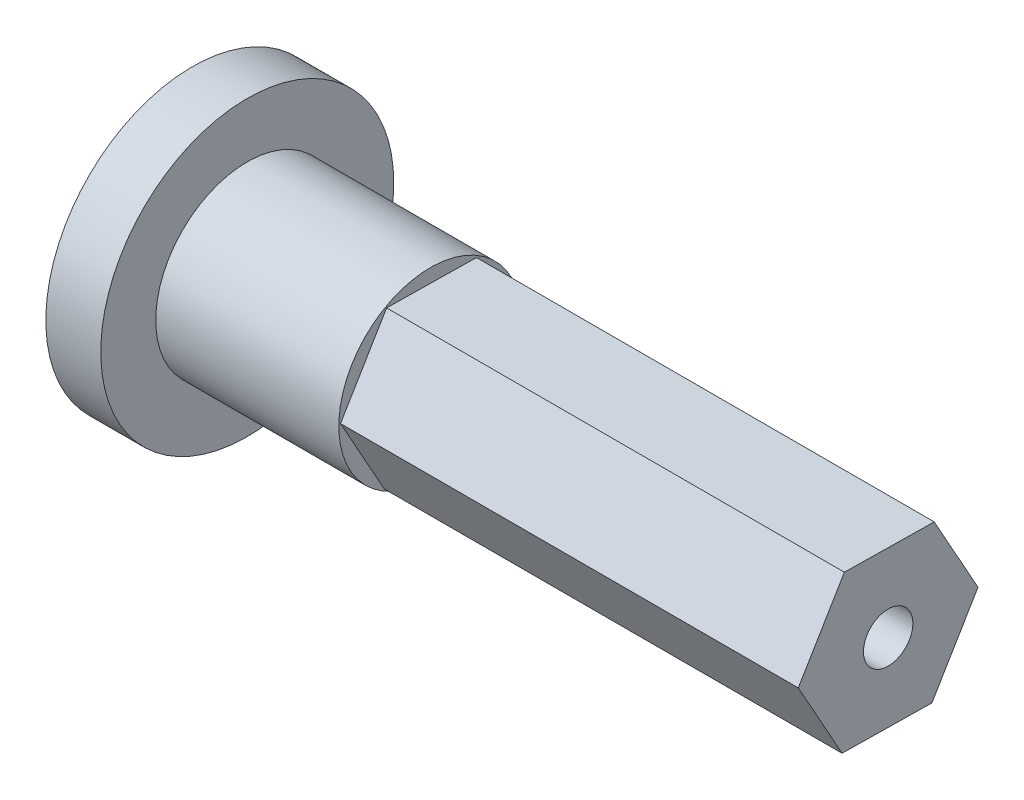
ISO-10303-21;
HEADER;
FILE_DESCRIPTION(('STEP AP214'),'2;1');
FILE_NAME('part.step','',(''),(''),'','','');
FILE_SCHEMA(('AUTOMOTIVE_DESIGN { 1 0 10303 214 1 1 1 1 }'));
ENDSEC;
DATA;
#1=APPLICATION_CONTEXT('core data for automotive mechanical design processes');
#2=APPLICATION_PROTOCOL_DEFINITION('international standard','automotive_design',2000,#1);
#3=PRODUCT_CONTEXT('',#1,'mechanical');
#4=PRODUCT('Part','Part','',(#3));
#5=PRODUCT_RELATED_PRODUCT_CATEGORY('part','',(#4));
#6=PRODUCT_DEFINITION_FORMATION('','',#4);
#7=PRODUCT_DEFINITION_CONTEXT('part definition',#1,'design');
#8=PRODUCT_DEFINITION('design','',#6,#7);
#9=PRODUCT_DEFINITION_SHAPE('','',#8);
#10=(LENGTH_UNIT() NAMED_UNIT(*) SI_UNIT(.MILLI.,.METRE.));
#11=(NAMED_UNIT(*) PLANE_ANGLE_UNIT() SI_UNIT($,.RADIAN.));
#12=(NAMED_UNIT(*) SI_UNIT($,.STERADIAN.) SOLID_ANGLE_UNIT());
#13=UNCERTAINTY_MEASURE_WITH_UNIT(LENGTH_MEASURE(1.E-05),#10,'distance_accuracy_value','');
#14=(GEOMETRIC_REPRESENTATION_CONTEXT(3) GLOBAL_UNCERTAINTY_ASSIGNED_CONTEXT((#13)) GLOBAL_UNIT_ASSIGNED_CONTEXT((#10,
#11,#12)) REPRESENTATION_CONTEXT('',''));
#15=CARTESIAN_POINT('',(0.,0.,0.));
#16=DIRECTION('',(0.,0.,1.));
#17=DIRECTION('',(1.,0.,0.));
#18=AXIS2_PLACEMENT_3D('',#15,#16,#17);
#19=CARTESIAN_POINT('',(3.,0.,0.));
#20=DIRECTION('',(-1.,0.,0.));
#21=DIRECTION('',(0.,0.,1.));
#22=AXIS2_PLACEMENT_3D('',#19,#20,#21);
#23=CYLINDRICAL_SURFACE('',#22,8.);
#24=CARTESIAN_POINT('',(3.,0.,0.));
#25=DIRECTION('',(1.,0.,0.));
#26=DIRECTION('',(0.,0.,-1.));
#27=AXIS2_PLACEMENT_3D('',#24,#25,#26);
#28=CIRCLE('',#27,8.);
#29=CARTESIAN_POINT('',(3.,0.,-8.));
#30=VERTEX_POINT('',#29);
#31=EDGE_CURVE('E47',#30,#30,#28,.T.);
#32=ORIENTED_EDGE('',*,*,#31,.F.);
#33=EDGE_LOOP('',(#32));
#34=FACE_BOUND('',#33,.T.);
#35=CARTESIAN_POINT('',(0.,0.,0.));
#36=DIRECTION('',(1.,0.,0.));
#37=DIRECTION('',(0.,0.,-1.));
#38=AXIS2_PLACEMENT_3D('',#35,#36,#37);
#39=CIRCLE('',#38,8.);
#40=CARTESIAN_POINT('',(0.,0.,-8.));
#41=VERTEX_POINT('',#40);
#42=EDGE_CURVE('E42',#41,#41,#39,.T.);
#43=ORIENTED_EDGE('',*,*,#42,.T.);
#44=EDGE_LOOP('',(#43));
#45=FACE_BOUND('',#44,.T.);
#46=ADVANCED_FACE('F39',(#34,#45),#23,.T.);
#47=CARTESIAN_POINT('',(3.,0.,0.));
#48=DIRECTION('',(1.,0.,0.));
#49=DIRECTION('',(0.,0.,-1.));
#50=AXIS2_PLACEMENT_3D('',#47,#48,#49);
#51=PLANE('',#50);
#52=CARTESIAN_POINT('',(3.,0.,0.));
#53=DIRECTION('',(1.,0.,0.));
#54=DIRECTION('',(0.,0.,-1.));
#55=AXIS2_PLACEMENT_3D('',#52,#53,#54);
#56=CIRCLE('',#55,5.);
#57=CARTESIAN_POINT('',(3.,0.,-5.));
#58=VERTEX_POINT('',#57);
#59=EDGE_CURVE('E11',#58,#58,#56,.T.);
#60=ORIENTED_EDGE('',*,*,#59,.F.);
#61=EDGE_LOOP('',(#60));
#62=FACE_BOUND('',#61,.T.);
#63=ORIENTED_EDGE('',*,*,#31,.T.);
#64=EDGE_LOOP('',(#63));
#65=FACE_BOUND('',#64,.T.);
#66=ADVANCED_FACE('F247',(#62,#65),#51,.T.);
#67=CARTESIAN_POINT('',(0.,0.,0.));
#68=DIRECTION('',(1.,0.,0.));
#69=DIRECTION('',(0.,0.,-1.));
#70=AXIS2_PLACEMENT_3D('',#67,#68,#69);
#71=PLANE('',#70);
#72=DIRECTION('',(0.,0.5,0.866025403784439));
#73=VECTOR('',#72,1.);
#74=CARTESIAN_POINT('',(0.,-2.3094010767585,0.));
#75=LINE('',#74,#73);
#76=CARTESIAN_POINT('',(0.,-2.3094010767585,0.));
#77=VERTEX_POINT('',#76);
#78=CARTESIAN_POINT('',(0.,-1.15470053837925,2.));
#79=VERTEX_POINT('',#78);
#80=EDGE_CURVE('E164',#77,#79,#75,.T.);
#81=ORIENTED_EDGE('',*,*,#80,.F.);
#82=DIRECTION('',(0.,-0.5,0.866025403784439));
#83=VECTOR('',#82,1.);
#84=CARTESIAN_POINT('',(0.,-1.15470053837925,-2.));
#85=LINE('',#84,#83);
#86=CARTESIAN_POINT('',(0.,-1.15470053837925,-2.));
#87=VERTEX_POINT('',#86);
#88=EDGE_CURVE('E55',#87,#77,#85,.T.);
#89=ORIENTED_EDGE('',*,*,#88,.F.);
#90=DIRECTION('',(0.,-1.,0.));
#91=VECTOR('',#90,1.);
#92=CARTESIAN_POINT('',(0.,1.15470053837925,-2.));
#93=LINE('',#92,#91);
#94=CARTESIAN_POINT('',(0.,1.15470053837925,-2.));
#95=VERTEX_POINT('',#94);
#96=EDGE_CURVE('E150',#95,#87,#93,.T.);
#97=ORIENTED_EDGE('',*,*,#96,.F.);
#98=DIRECTION('',(0.,-0.5,-0.866025403784439));
#99=VECTOR('',#98,1.);
#100=CARTESIAN_POINT('',(0.,2.3094010767585,0.));
#101=LINE('',#100,#99);
#102=CARTESIAN_POINT('',(0.,2.3094010767585,0.));
#103=VERTEX_POINT('',#102);
#104=EDGE_CURVE('E153',#103,#95,#101,.T.);
#105=ORIENTED_EDGE('',*,*,#104,.F.);
#106=DIRECTION('',(0.,0.5,-0.866025403784439));
#107=VECTOR('',#106,1.);
#108=CARTESIAN_POINT('',(0.,1.15470053837925,2.));
#109=LINE('',#108,#107);
#110=CARTESIAN_POINT('',(0.,1.15470053837925,2.));
#111=VERTEX_POINT('',#110);
#112=EDGE_CURVE('E169',#111,#103,#109,.T.);
#113=ORIENTED_EDGE('',*,*,#112,.F.);
#114=DIRECTION('',(0.,1.,0.));
#115=VECTOR('',#114,1.);
#116=CARTESIAN_POINT('',(0.,-1.15470053837925,2.));
#117=LINE('',#116,#115);
#118=EDGE_CURVE('E166',#79,#111,#117,.T.);
#119=ORIENTED_EDGE('',*,*,#118,.F.);
#120=EDGE_LOOP('',(#81,#89,#97,#105,#113,#119));
#121=FACE_BOUND('',#120,.T.);
#122=ORIENTED_EDGE('',*,*,#42,.F.);
#123=EDGE_LOOP('',(#122));
#124=FACE_BOUND('',#123,.T.);
#125=ADVANCED_FACE('F244',(#121,#124),#71,.F.);
#126=CARTESIAN_POINT('',(13.,0.,0.));
#127=DIRECTION('',(-1.,0.,0.));
#128=DIRECTION('',(0.,0.,1.));
#129=AXIS2_PLACEMENT_3D('',#126,#127,#128);
#130=CYLINDRICAL_SURFACE('',#129,5.);
#131=CARTESIAN_POINT('',(13.,0.,0.));
#132=DIRECTION('',(1.,0.,0.));
#133=DIRECTION('',(0.,0.,-1.));
#134=AXIS2_PLACEMENT_3D('',#131,#132,#133);
#135=CIRCLE('',#134,5.);
#136=CARTESIAN_POINT('',(13.,0.,-5.));
#137=VERTEX_POINT('',#136);
#138=EDGE_CURVE('E235',#137,#137,#135,.T.);
#139=ORIENTED_EDGE('',*,*,#138,.F.);
#140=EDGE_LOOP('',(#139));
#141=FACE_BOUND('',#140,.T.);
#142=ORIENTED_EDGE('',*,*,#59,.T.);
#143=EDGE_LOOP('',(#142));
#144=FACE_BOUND('',#143,.T.);
#145=ADVANCED_FACE('F246',(#141,#144),#130,.T.);
#146=CARTESIAN_POINT('',(13.,0.,0.));
#147=DIRECTION('',(1.,0.,0.));
#148=DIRECTION('',(0.,0.,-1.));
#149=AXIS2_PLACEMENT_3D('',#146,#147,#148);
#150=PLANE('',#149);
#151=DIRECTION('',(0.,-0.0149359954370282,-0.999888451798652));
#152=VECTOR('',#151,1.);
#153=CARTESIAN_POINT('',(13.,-4.21287689095299,2.51694291453096));
#154=LINE('',#153,#152);
#155=CARTESIAN_POINT('',(13.,-4.21287689095299,2.51694291453096));
#156=VERTEX_POINT('',#155);
#157=CARTESIAN_POINT('',(13.,-4.28617494933555,-2.38998695331622));
#158=VERTEX_POINT('',#157);
#159=EDGE_CURVE('E63',#156,#158,#154,.T.);
#160=ORIENTED_EDGE('',*,*,#159,.F.);
#161=DIRECTION('',(0.,-0.873396797926839,-0.487009274420051));
#162=VECTOR('',#161,1.);
#163=CARTESIAN_POINT('',(13.,0.0732980583825546,4.90692986784718));
#164=LINE('',#163,#162);
#165=CARTESIAN_POINT('',(13.,0.0732980583825546,4.90692986784718));
#166=VERTEX_POINT('',#165);
#167=EDGE_CURVE('E193',#166,#156,#164,.T.);
#168=ORIENTED_EDGE('',*,*,#167,.F.);
#169=DIRECTION('',(0.,-0.858460802489811,0.512879177378601));
#170=VECTOR('',#169,1.);
#171=CARTESIAN_POINT('',(13.,4.28617494933555,2.38998695331622));
#172=LINE('',#171,#170);
#173=CARTESIAN_POINT('',(13.,4.28617494933555,2.38998695331622));
#174=VERTEX_POINT('',#173);
#175=EDGE_CURVE('E214',#174,#166,#172,.T.);
#176=ORIENTED_EDGE('',*,*,#175,.F.);
#177=DIRECTION('',(0.,0.014935995437028,0.999888451798652));
#178=VECTOR('',#177,1.);
#179=CARTESIAN_POINT('',(13.,4.21287689095299,-2.51694291453096));
#180=LINE('',#179,#178);
#181=CARTESIAN_POINT('',(13.,4.21287689095299,-2.51694291453096));
#182=VERTEX_POINT('',#181);
#183=EDGE_CURVE('E211',#182,#174,#180,.T.);
#184=ORIENTED_EDGE('',*,*,#183,.F.);
#185=DIRECTION('',(0.,0.873396797926839,0.487009274420051));
#186=VECTOR('',#185,1.);
#187=CARTESIAN_POINT('',(13.,-0.0732980583825546,-4.90692986784717));
#188=LINE('',#187,#186);
#189=CARTESIAN_POINT('',(13.,-0.0732980583825546,-4.90692986784717));
#190=VERTEX_POINT('',#189);
#191=EDGE_CURVE('E208',#190,#182,#188,.T.);
#192=ORIENTED_EDGE('',*,*,#191,.F.);
#193=DIRECTION('',(0.,0.858460802489811,-0.5128791773786));
#194=VECTOR('',#193,1.);
#195=CARTESIAN_POINT('',(13.,-4.28617494933555,-2.38998695331622));
#196=LINE('',#195,#194);
#197=EDGE_CURVE('E205',#158,#190,#196,.T.);
#198=ORIENTED_EDGE('',*,*,#197,.F.);
#199=EDGE_LOOP('',(#160,#168,#176,#184,#192,#198));
#200=FACE_BOUND('',#199,.T.);
#201=ORIENTED_EDGE('',*,*,#138,.T.);
#202=EDGE_LOOP('',(#201));
#203=FACE_BOUND('',#202,.T.);
#204=ADVANCED_FACE('F254',(#200,#203),#150,.T.);
#205=CARTESIAN_POINT('',(38.,-4.21287689095299,2.51694291453096));
#206=DIRECTION('',(0.,0.999888451798652,-0.0149359954370282));
#207=DIRECTION('',(0.,0.0149359954370282,0.999888451798652));
#208=AXIS2_PLACEMENT_3D('',#205,#206,#207);
#209=PLANE('',#208);
#210=ORIENTED_EDGE('',*,*,#159,.T.);
#211=DIRECTION('',(-1.,0.,0.));
#212=VECTOR('',#211,1.);
#213=CARTESIAN_POINT('',(38.,-4.28617494933555,-2.38998695331622));
#214=LINE('',#213,#212);
#215=CARTESIAN_POINT('',(38.,-4.28617494933555,-2.38998695331622));
#216=VERTEX_POINT('',#215);
#217=EDGE_CURVE('E232',#216,#158,#214,.T.);
#218=ORIENTED_EDGE('',*,*,#217,.F.);
#219=DIRECTION('',(0.,-0.0149359954370282,-0.999888451798652));
#220=VECTOR('',#219,1.);
#221=CARTESIAN_POINT('',(38.,-4.21287689095299,2.51694291453096));
#222=LINE('',#221,#220);
#223=CARTESIAN_POINT('',(38.,-4.21287689095299,2.51694291453096));
#224=VERTEX_POINT('',#223);
#225=EDGE_CURVE('E189',#224,#216,#222,.T.);
#226=ORIENTED_EDGE('',*,*,#225,.F.);
#227=DIRECTION('',(-1.,0.,0.));
#228=VECTOR('',#227,1.);
#229=CARTESIAN_POINT('',(38.,-4.21287689095299,2.51694291453096));
#230=LINE('',#229,#228);
#231=EDGE_CURVE('E203',#224,#156,#230,.T.);
#232=ORIENTED_EDGE('',*,*,#231,.T.);
#233=EDGE_LOOP('',(#210,#218,#226,#232));
#234=FACE_BOUND('',#233,.T.);
#235=ADVANCED_FACE('F281',(#234),#209,.F.);
#236=CARTESIAN_POINT('',(38.,-4.28617494933555,-2.38998695331622));
#237=DIRECTION('',(0.,0.5128791773786,0.858460802489811));
#238=DIRECTION('',(0.,-0.858460802489811,0.5128791773786));
#239=AXIS2_PLACEMENT_3D('',#236,#237,#238);
#240=PLANE('',#239);
#241=ORIENTED_EDGE('',*,*,#197,.T.);
#242=DIRECTION('',(-1.,0.,0.));
#243=VECTOR('',#242,1.);
#244=CARTESIAN_POINT('',(38.,-0.0732980583825546,-4.90692986784717));
#245=LINE('',#244,#243);
#246=CARTESIAN_POINT('',(38.,-0.0732980583825546,-4.90692986784717));
#247=VERTEX_POINT('',#246);
#248=EDGE_CURVE('E229',#247,#190,#245,.T.);
#249=ORIENTED_EDGE('',*,*,#248,.F.);
#250=DIRECTION('',(0.,0.858460802489811,-0.5128791773786));
#251=VECTOR('',#250,1.);
#252=CARTESIAN_POINT('',(38.,-4.28617494933555,-2.38998695331622));
#253=LINE('',#252,#251);
#254=EDGE_CURVE('E192',#216,#247,#253,.T.);
#255=ORIENTED_EDGE('',*,*,#254,.F.);
#256=ORIENTED_EDGE('',*,*,#217,.T.);
#257=EDGE_LOOP('',(#241,#249,#255,#256));
#258=FACE_BOUND('',#257,.T.);
#259=ADVANCED_FACE('F289',(#258),#240,.F.);
#260=CARTESIAN_POINT('',(38.,-0.0732980583825546,-4.90692986784717));
#261=DIRECTION('',(0.,-0.487009274420051,0.873396797926839));
#262=DIRECTION('',(0.,-0.873396797926839,-0.487009274420051));
#263=AXIS2_PLACEMENT_3D('',#260,#261,#262);
#264=PLANE('',#263);
#265=ORIENTED_EDGE('',*,*,#191,.T.);
#266=DIRECTION('',(-1.,0.,0.));
#267=VECTOR('',#266,1.);
#268=CARTESIAN_POINT('',(38.,4.21287689095299,-2.51694291453096));
#269=LINE('',#268,#267);
#270=CARTESIAN_POINT('',(38.,4.21287689095299,-2.51694291453096));
#271=VERTEX_POINT('',#270);
#272=EDGE_CURVE('E226',#271,#182,#269,.T.);
#273=ORIENTED_EDGE('',*,*,#272,.F.);
#274=DIRECTION('',(0.,0.873396797926839,0.487009274420051));
#275=VECTOR('',#274,1.);
#276=CARTESIAN_POINT('',(38.,-0.0732980583825546,-4.90692986784717));
#277=LINE('',#276,#275);
#278=EDGE_CURVE('E195',#247,#271,#277,.T.);
#279=ORIENTED_EDGE('',*,*,#278,.F.);
#280=ORIENTED_EDGE('',*,*,#248,.T.);
#281=EDGE_LOOP('',(#265,#273,#279,#280));
#282=FACE_BOUND('',#281,.T.);
#283=ADVANCED_FACE('F298',(#282),#264,.F.);
#284=CARTESIAN_POINT('',(38.,4.21287689095299,-2.51694291453096));
#285=DIRECTION('',(0.,-0.999888451798652,0.014935995437028));
#286=DIRECTION('',(0.,-0.014935995437028,-0.999888451798652));
#287=AXIS2_PLACEMENT_3D('',#284,#285,#286);
#288=PLANE('',#287);
#289=ORIENTED_EDGE('',*,*,#183,.T.);
#290=DIRECTION('',(-1.,0.,0.));
#291=VECTOR('',#290,1.);
#292=CARTESIAN_POINT('',(38.,4.28617494933555,2.38998695331622));
#293=LINE('',#292,#291);
#294=CARTESIAN_POINT('',(38.,4.28617494933555,2.38998695331622));
#295=VERTEX_POINT('',#294);
#296=EDGE_CURVE('E223',#295,#174,#293,.T.);
#297=ORIENTED_EDGE('',*,*,#296,.F.);
#298=DIRECTION('',(0.,0.014935995437028,0.999888451798652));
#299=VECTOR('',#298,1.);
#300=CARTESIAN_POINT('',(38.,4.21287689095299,-2.51694291453096));
#301=LINE('',#300,#299);
#302=EDGE_CURVE('E197',#271,#295,#301,.T.);
#303=ORIENTED_EDGE('',*,*,#302,.F.);
#304=ORIENTED_EDGE('',*,*,#272,.T.);
#305=EDGE_LOOP('',(#289,#297,#303,#304));
#306=FACE_BOUND('',#305,.T.);
#307=ADVANCED_FACE('F307',(#306),#288,.F.);
#308=CARTESIAN_POINT('',(38.,4.28617494933555,2.38998695331622));
#309=DIRECTION('',(0.,-0.512879177378601,-0.858460802489811));
#310=DIRECTION('',(0.,0.858460802489811,-0.512879177378601));
#311=AXIS2_PLACEMENT_3D('',#308,#309,#310);
#312=PLANE('',#311);
#313=ORIENTED_EDGE('',*,*,#175,.T.);
#314=DIRECTION('',(-1.,0.,0.));
#315=VECTOR('',#314,1.);
#316=CARTESIAN_POINT('',(38.,0.0732980583825546,4.90692986784718));
#317=LINE('',#316,#315);
#318=CARTESIAN_POINT('',(38.,0.0732980583825546,4.90692986784718));
#319=VERTEX_POINT('',#318);
#320=EDGE_CURVE('E220',#319,#166,#317,.T.);
#321=ORIENTED_EDGE('',*,*,#320,.F.);
#322=DIRECTION('',(0.,-0.858460802489811,0.512879177378601));
#323=VECTOR('',#322,1.);
#324=CARTESIAN_POINT('',(38.,4.28617494933555,2.38998695331622));
#325=LINE('',#324,#323);
#326=EDGE_CURVE('E199',#295,#319,#325,.T.);
#327=ORIENTED_EDGE('',*,*,#326,.F.);
#328=ORIENTED_EDGE('',*,*,#296,.T.);
#329=EDGE_LOOP('',(#313,#321,#327,#328));
#330=FACE_BOUND('',#329,.T.);
#331=ADVANCED_FACE('F316',(#330),#312,.F.);
#332=CARTESIAN_POINT('',(38.,0.0732980583825546,4.90692986784718));
#333=DIRECTION('',(0.,0.487009274420051,-0.873396797926839));
#334=DIRECTION('',(0.,0.873396797926839,0.487009274420051));
#335=AXIS2_PLACEMENT_3D('',#332,#333,#334);
#336=PLANE('',#335);
#337=ORIENTED_EDGE('',*,*,#167,.T.);
#338=ORIENTED_EDGE('',*,*,#231,.F.);
#339=DIRECTION('',(0.,-0.873396797926839,-0.487009274420051));
#340=VECTOR('',#339,1.);
#341=CARTESIAN_POINT('',(38.,0.0732980583825546,4.90692986784718));
#342=LINE('',#341,#340);
#343=EDGE_CURVE('E201',#319,#224,#342,.T.);
#344=ORIENTED_EDGE('',*,*,#343,.F.);
#345=ORIENTED_EDGE('',*,*,#320,.T.);
#346=EDGE_LOOP('',(#337,#338,#344,#345));
#347=FACE_BOUND('',#346,.T.);
#348=ADVANCED_FACE('F325',(#347),#336,.F.);
#349=CARTESIAN_POINT('',(38.,0.,0.));
#350=DIRECTION('',(1.,0.,0.));
#351=DIRECTION('',(0.,0.,-1.));
#352=AXIS2_PLACEMENT_3D('',#349,#350,#351);
#353=PLANE('',#352);
#354=CARTESIAN_POINT('',(38.,0.,0.));
#355=DIRECTION('',(1.,0.,0.));
#356=DIRECTION('',(0.,0.,-1.));
#357=AXIS2_PLACEMENT_3D('',#354,#355,#356);
#358=CIRCLE('',#357,1.35);
#359=CARTESIAN_POINT('',(38.,0.,-1.35));
#360=VERTEX_POINT('',#359);
#361=EDGE_CURVE('E176',#360,#360,#358,.T.);
#362=ORIENTED_EDGE('',*,*,#361,.F.);
#363=EDGE_LOOP('',(#362));
#364=FACE_BOUND('',#363,.T.);
#365=ORIENTED_EDGE('',*,*,#225,.T.);
#366=ORIENTED_EDGE('',*,*,#254,.T.);
#367=ORIENTED_EDGE('',*,*,#278,.T.);
#368=ORIENTED_EDGE('',*,*,#302,.T.);
#369=ORIENTED_EDGE('',*,*,#326,.T.);
#370=ORIENTED_EDGE('',*,*,#343,.T.);
#371=EDGE_LOOP('',(#365,#366,#367,#368,#369,#370));
#372=FACE_BOUND('',#371,.T.);
#373=ADVANCED_FACE('F334',(#364,#372),#353,.T.);
#374=CARTESIAN_POINT('',(28.,0.,0.));
#375=DIRECTION('',(1.,0.,0.));
#376=DIRECTION('',(0.,0.,-1.));
#377=AXIS2_PLACEMENT_3D('',#374,#375,#376);
#378=CYLINDRICAL_SURFACE('',#377,1.35);
#379=CARTESIAN_POINT('',(28.,0.,0.));
#380=DIRECTION('',(1.,0.,0.));
#381=DIRECTION('',(0.,0.,-1.));
#382=AXIS2_PLACEMENT_3D('',#379,#380,#381);
#383=CIRCLE('',#382,1.35);
#384=CARTESIAN_POINT('',(28.,0.,-1.35));
#385=VERTEX_POINT('',#384);
#386=EDGE_CURVE('E184',#385,#385,#383,.T.);
#387=ORIENTED_EDGE('',*,*,#386,.F.);
#388=EDGE_LOOP('',(#387));
#389=FACE_BOUND('',#388,.T.);
#390=ORIENTED_EDGE('',*,*,#361,.T.);
#391=EDGE_LOOP('',(#390));
#392=FACE_BOUND('',#391,.T.);
#393=ADVANCED_FACE('F343',(#389,#392),#378,.F.);
#394=CARTESIAN_POINT('',(28.,0.,0.));
#395=DIRECTION('',(1.,0.,0.));
#396=DIRECTION('',(0.,0.,-1.));
#397=AXIS2_PLACEMENT_3D('',#394,#395,#396);
#398=PLANE('',#397);
#399=ORIENTED_EDGE('',*,*,#386,.T.);
#400=EDGE_LOOP('',(#399));
#401=FACE_BOUND('',#400,.T.);
#402=ADVANCED_FACE('F351',(#401),#398,.T.);
#403=CARTESIAN_POINT('',(23.5,-1.15470053837925,-2.));
#404=DIRECTION('',(0.,-0.866025403784438,-0.5));
#405=DIRECTION('',(0.,0.5,-0.866025403784439));
#406=AXIS2_PLACEMENT_3D('',#403,#404,#405);
#407=PLANE('',#406);
#408=ORIENTED_EDGE('',*,*,#88,.T.);
#409=DIRECTION('',(-1.,0.,0.));
#410=VECTOR('',#409,1.);
#411=CARTESIAN_POINT('',(23.5,-2.3094010767585,0.));
#412=LINE('',#411,#410);
#413=CARTESIAN_POINT('',(23.5,-2.3094010767585,0.));
#414=VERTEX_POINT('',#413);
#415=EDGE_CURVE('E127',#414,#77,#412,.T.);
#416=ORIENTED_EDGE('',*,*,#415,.F.);
#417=DIRECTION('',(0.,-0.5,0.866025403784439));
#418=VECTOR('',#417,1.);
#419=CARTESIAN_POINT('',(23.5,-1.15470053837925,-2.));
#420=LINE('',#419,#418);
#421=CARTESIAN_POINT('',(23.5,-1.15470053837925,-2.));
#422=VERTEX_POINT('',#421);
#423=EDGE_CURVE('E131',#422,#414,#420,.T.);
#424=ORIENTED_EDGE('',*,*,#423,.F.);
#425=DIRECTION('',(-1.,0.,0.));
#426=VECTOR('',#425,1.);
#427=CARTESIAN_POINT('',(23.5,-1.15470053837925,-2.));
#428=LINE('',#427,#426);
#429=EDGE_CURVE('E174',#422,#87,#428,.T.);
#430=ORIENTED_EDGE('',*,*,#429,.T.);
#431=EDGE_LOOP('',(#408,#416,#424,#430));
#432=FACE_BOUND('',#431,.T.);
#433=ADVANCED_FACE('F129',(#432),#407,.F.);
#434=CARTESIAN_POINT('',(23.5,1.15470053837925,-2.));
#435=DIRECTION('',(0.,0.,-1.));
#436=DIRECTION('',(-1.,0.,0.));
#437=AXIS2_PLACEMENT_3D('',#434,#435,#436);
#438=PLANE('',#437);
#439=ORIENTED_EDGE('',*,*,#96,.T.);
#440=ORIENTED_EDGE('',*,*,#429,.F.);
#441=DIRECTION('',(0.,-1.,0.));
#442=VECTOR('',#441,1.);
#443=CARTESIAN_POINT('',(23.5,1.15470053837925,-2.));
#444=LINE('',#443,#442);
#445=CARTESIAN_POINT('',(23.5,1.15470053837925,-2.));
#446=VERTEX_POINT('',#445);
#447=EDGE_CURVE('E137',#446,#422,#444,.T.);
#448=ORIENTED_EDGE('',*,*,#447,.F.);
#449=DIRECTION('',(-1.,0.,0.));
#450=VECTOR('',#449,1.);
#451=CARTESIAN_POINT('',(23.5,1.15470053837925,-2.));
#452=LINE('',#451,#450);
#453=EDGE_CURVE('E177',#446,#95,#452,.T.);
#454=ORIENTED_EDGE('',*,*,#453,.T.);
#455=EDGE_LOOP('',(#439,#440,#448,#454));
#456=FACE_BOUND('',#455,.T.);
#457=ADVANCED_FACE('F370',(#456),#438,.F.);
#458=CARTESIAN_POINT('',(23.5,2.3094010767585,0.));
#459=DIRECTION('',(0.,0.866025403784439,-0.5));
#460=DIRECTION('',(0.,0.5,0.866025403784439));
#461=AXIS2_PLACEMENT_3D('',#458,#459,#460);
#462=PLANE('',#461);
#463=ORIENTED_EDGE('',*,*,#104,.T.);
#464=ORIENTED_EDGE('',*,*,#453,.F.);
#465=DIRECTION('',(0.,-0.5,-0.866025403784439));
#466=VECTOR('',#465,1.);
#467=CARTESIAN_POINT('',(23.5,2.3094010767585,0.));
#468=LINE('',#467,#466);
#469=CARTESIAN_POINT('',(23.5,2.3094010767585,0.));
#470=VERTEX_POINT('',#469);
#471=EDGE_CURVE('E160',#470,#446,#468,.T.);
#472=ORIENTED_EDGE('',*,*,#471,.F.);
#473=DIRECTION('',(-1.,0.,0.));
#474=VECTOR('',#473,1.);
#475=CARTESIAN_POINT('',(23.5,2.3094010767585,0.));
#476=LINE('',#475,#474);
#477=EDGE_CURVE('E179',#470,#103,#476,.T.);
#478=ORIENTED_EDGE('',*,*,#477,.T.);
#479=EDGE_LOOP('',(#463,#464,#472,#478));
#480=FACE_BOUND('',#479,.T.);
#481=ADVANCED_FACE('F379',(#480),#462,.F.);
#482=CARTESIAN_POINT('',(23.5,1.15470053837925,2.));
#483=DIRECTION('',(0.,0.866025403784438,0.5));
#484=DIRECTION('',(0.,-0.5,0.866025403784439));
#485=AXIS2_PLACEMENT_3D('',#482,#483,#484);
#486=PLANE('',#485);
#487=ORIENTED_EDGE('',*,*,#112,.T.);
#488=ORIENTED_EDGE('',*,*,#477,.F.);
#489=DIRECTION('',(0.,0.5,-0.866025403784439));
#490=VECTOR('',#489,1.);
#491=CARTESIAN_POINT('',(23.5,1.15470053837925,2.));
#492=LINE('',#491,#490);
#493=CARTESIAN_POINT('',(23.5,1.15470053837925,2.));
#494=VERTEX_POINT('',#493);
#495=EDGE_CURVE('E157',#494,#470,#492,.T.);
#496=ORIENTED_EDGE('',*,*,#495,.F.);
#497=DIRECTION('',(-1.,0.,0.));
#498=VECTOR('',#497,1.);
#499=CARTESIAN_POINT('',(23.5,1.15470053837925,2.));
#500=LINE('',#499,#498);
#501=EDGE_CURVE('E181',#494,#111,#500,.T.);
#502=ORIENTED_EDGE('',*,*,#501,.T.);
#503=EDGE_LOOP('',(#487,#488,#496,#502));
#504=FACE_BOUND('',#503,.T.);
#505=ADVANCED_FACE('F389',(#504),#486,.F.);
#506=CARTESIAN_POINT('',(23.5,-1.15470053837925,2.));
#507=DIRECTION('',(0.,0.,1.));
#508=DIRECTION('',(1.,0.,0.));
#509=AXIS2_PLACEMENT_3D('',#506,#507,#508);
#510=PLANE('',#509);
#511=ORIENTED_EDGE('',*,*,#118,.T.);
#512=ORIENTED_EDGE('',*,*,#501,.F.);
#513=DIRECTION('',(0.,1.,0.));
#514=VECTOR('',#513,1.);
#515=CARTESIAN_POINT('',(23.5,-1.15470053837925,2.));
#516=LINE('',#515,#514);
#517=CARTESIAN_POINT('',(23.5,-1.15470053837925,2.));
#518=VERTEX_POINT('',#517);
#519=EDGE_CURVE('E145',#518,#494,#516,.T.);
#520=ORIENTED_EDGE('',*,*,#519,.F.);
#521=DIRECTION('',(-1.,0.,0.));
#522=VECTOR('',#521,1.);
#523=CARTESIAN_POINT('',(23.5,-1.15470053837925,2.));
#524=LINE('',#523,#522);
#525=EDGE_CURVE('E136',#518,#79,#524,.T.);
#526=ORIENTED_EDGE('',*,*,#525,.T.);
#527=EDGE_LOOP('',(#511,#512,#520,#526));
#528=FACE_BOUND('',#527,.T.);
#529=ADVANCED_FACE('F399',(#528),#510,.F.);
#530=CARTESIAN_POINT('',(23.5,-2.3094010767585,0.));
#531=DIRECTION('',(0.,-0.866025403784438,0.5));
#532=DIRECTION('',(0.,-0.5,-0.866025403784439));
#533=AXIS2_PLACEMENT_3D('',#530,#531,#532);
#534=PLANE('',#533);
#535=ORIENTED_EDGE('',*,*,#80,.T.);
#536=ORIENTED_EDGE('',*,*,#525,.F.);
#537=DIRECTION('',(0.,0.5,0.866025403784439));
#538=VECTOR('',#537,1.);
#539=CARTESIAN_POINT('',(23.5,-2.3094010767585,0.));
#540=LINE('',#539,#538);
#541=EDGE_CURVE('E140',#414,#518,#540,.T.);
#542=ORIENTED_EDGE('',*,*,#541,.F.);
#543=ORIENTED_EDGE('',*,*,#415,.T.);
#544=EDGE_LOOP('',(#535,#536,#542,#543));
#545=FACE_BOUND('',#544,.T.);
#546=ADVANCED_FACE('F141',(#545),#534,.F.);
#547=CARTESIAN_POINT('',(23.5,0.,0.));
#548=DIRECTION('',(-1.,0.,0.));
#549=DIRECTION('',(0.,0.,1.));
#550=AXIS2_PLACEMENT_3D('',#547,#548,#549);
#551=PLANE('',#550);
#552=ORIENTED_EDGE('',*,*,#423,.T.);
#553=ORIENTED_EDGE('',*,*,#541,.T.);
#554=ORIENTED_EDGE('',*,*,#519,.T.);
#555=ORIENTED_EDGE('',*,*,#495,.T.);
#556=ORIENTED_EDGE('',*,*,#471,.T.);
#557=ORIENTED_EDGE('',*,*,#447,.T.);
#558=EDGE_LOOP('',(#552,#553,#554,#555,#556,#557));
#559=FACE_BOUND('',#558,.T.);
#560=ADVANCED_FACE('F147',(#559),#551,.T.);
#561=CLOSED_SHELL('',(#46,#66,#125,#145,#204,#235,#259,#283,#307,#331,#348,#373,#393,#402,#433,
#457,#481,#505,#529,#546,#560));
#562=MANIFOLD_SOLID_BREP('B2',#561);
#563=ADVANCED_BREP_SHAPE_REPRESENTATION('',(#18,#562),#14);
#564=SHAPE_DEFINITION_REPRESENTATION(#9,#563);
ENDSEC;
END-ISO-10303-21;
